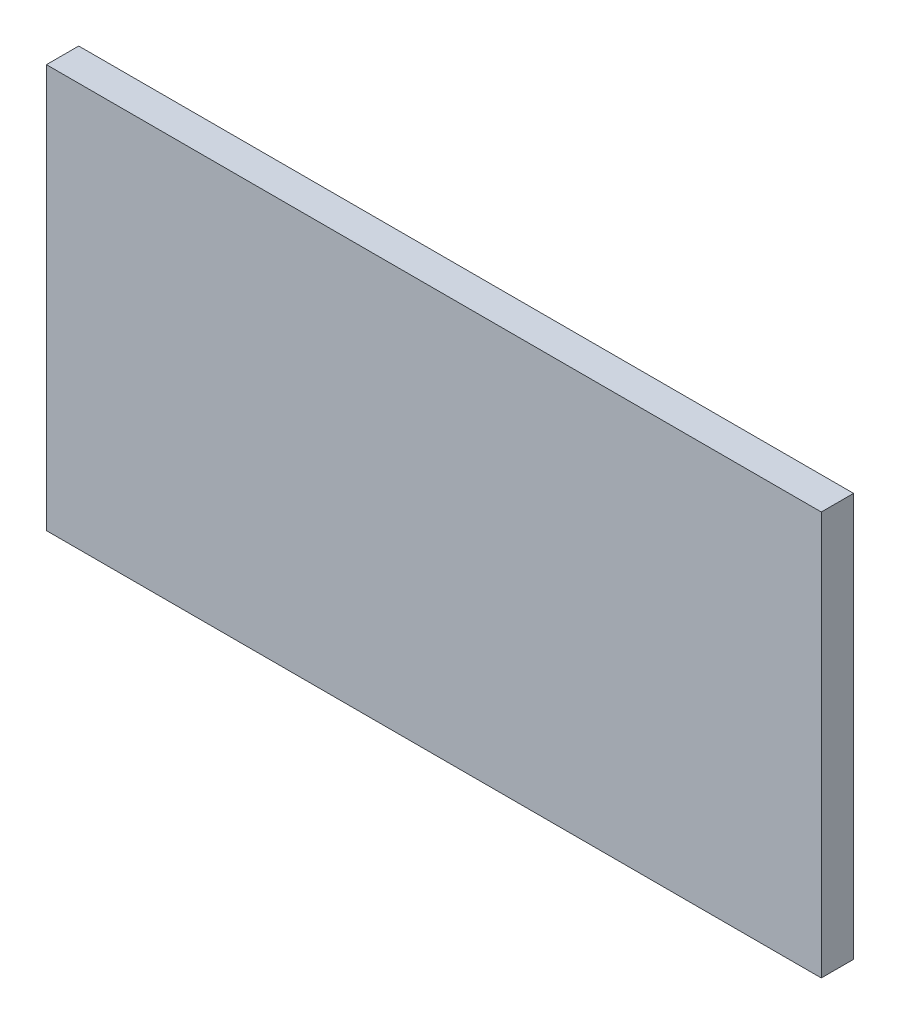
ISO-10303-21;
HEADER;
FILE_DESCRIPTION(('STEP AP214'),'2;1');
FILE_NAME('part.step','',(''),(''),'','','');
FILE_SCHEMA(('AUTOMOTIVE_DESIGN { 1 0 10303 214 1 1 1 1 }'));
ENDSEC;
DATA;
#1=APPLICATION_CONTEXT('core data for automotive mechanical design processes');
#2=APPLICATION_PROTOCOL_DEFINITION('international standard','automotive_design',2000,#1);
#3=PRODUCT_CONTEXT('',#1,'mechanical');
#4=PRODUCT('Part','Part','',(#3));
#5=PRODUCT_RELATED_PRODUCT_CATEGORY('part','',(#4));
#6=PRODUCT_DEFINITION_FORMATION('','',#4);
#7=PRODUCT_DEFINITION_CONTEXT('part definition',#1,'design');
#8=PRODUCT_DEFINITION('design','',#6,#7);
#9=PRODUCT_DEFINITION_SHAPE('','',#8);
#10=(LENGTH_UNIT() NAMED_UNIT(*) SI_UNIT(.MILLI.,.METRE.));
#11=(NAMED_UNIT(*) PLANE_ANGLE_UNIT() SI_UNIT($,.RADIAN.));
#12=(NAMED_UNIT(*) SI_UNIT($,.STERADIAN.) SOLID_ANGLE_UNIT());
#13=UNCERTAINTY_MEASURE_WITH_UNIT(LENGTH_MEASURE(1.E-05),#10,'distance_accuracy_value','');
#14=(GEOMETRIC_REPRESENTATION_CONTEXT(3) GLOBAL_UNCERTAINTY_ASSIGNED_CONTEXT((#13)) GLOBAL_UNIT_ASSIGNED_CONTEXT((#10,
#11,#12)) REPRESENTATION_CONTEXT('',''));
#15=CARTESIAN_POINT('',(0.,0.,0.));
#16=DIRECTION('',(0.,0.,1.));
#17=DIRECTION('',(1.,0.,0.));
#18=AXIS2_PLACEMENT_3D('',#15,#16,#17);
#19=CARTESIAN_POINT('',(187.894314585938,362.678539437355,-50.8));
#20=DIRECTION('',(-1.,0.,0.));
#21=DIRECTION('',(0.,0.,1.));
#22=AXIS2_PLACEMENT_3D('',#19,#20,#21);
#23=PLANE('',#22);
#24=DIRECTION('',(0.,-1.,0.));
#25=VECTOR('',#24,1.);
#26=CARTESIAN_POINT('',(187.894314585938,362.678539437355,0.));
#27=LINE('',#26,#25);
#28=CARTESIAN_POINT('',(187.894314585938,997.678539437355,0.));
#29=VERTEX_POINT('',#28);
#30=CARTESIAN_POINT('',(187.894314585938,362.678539437355,0.));
#31=VERTEX_POINT('',#30);
#32=EDGE_CURVE('E102',#29,#31,#27,.T.);
#33=ORIENTED_EDGE('',*,*,#32,.F.);
#34=DIRECTION('',(0.,0.,1.));
#35=VECTOR('',#34,1.);
#36=CARTESIAN_POINT('',(187.894314585938,997.678539437355,-50.8));
#37=LINE('',#36,#35);
#38=CARTESIAN_POINT('',(187.894314585938,997.678539437355,-50.8));
#39=VERTEX_POINT('',#38);
#40=EDGE_CURVE('E11',#39,#29,#37,.T.);
#41=ORIENTED_EDGE('',*,*,#40,.F.);
#42=DIRECTION('',(0.,-1.,0.));
#43=VECTOR('',#42,1.);
#44=CARTESIAN_POINT('',(187.894314585938,362.678539437355,-50.8));
#45=LINE('',#44,#43);
#46=CARTESIAN_POINT('',(187.894314585938,362.678539437355,-50.8));
#47=VERTEX_POINT('',#46);
#48=EDGE_CURVE('E96',#39,#47,#45,.T.);
#49=ORIENTED_EDGE('',*,*,#48,.T.);
#50=DIRECTION('',(0.,0.,1.));
#51=VECTOR('',#50,1.);
#52=CARTESIAN_POINT('',(187.894314585938,362.678539437355,-50.8));
#53=LINE('',#52,#51);
#54=EDGE_CURVE('E41',#47,#31,#53,.T.);
#55=ORIENTED_EDGE('',*,*,#54,.T.);
#56=EDGE_LOOP('',(#33,#41,#49,#55));
#57=FACE_BOUND('',#56,.T.);
#58=ADVANCED_FACE('F38',(#57),#23,.T.);
#59=CARTESIAN_POINT('',(187.894314585938,997.678539437355,-50.8));
#60=DIRECTION('',(0.,1.,0.));
#61=DIRECTION('',(0.,0.,1.));
#62=AXIS2_PLACEMENT_3D('',#59,#60,#61);
#63=PLANE('',#62);
#64=DIRECTION('',(-1.,0.,0.));
#65=VECTOR('',#64,1.);
#66=CARTESIAN_POINT('',(187.894314585938,997.678539437355,0.));
#67=LINE('',#66,#65);
#68=CARTESIAN_POINT('',(1407.09431458594,997.678539437355,0.));
#69=VERTEX_POINT('',#68);
#70=EDGE_CURVE('E98',#69,#29,#67,.T.);
#71=ORIENTED_EDGE('',*,*,#70,.F.);
#72=DIRECTION('',(0.,0.,1.));
#73=VECTOR('',#72,1.);
#74=CARTESIAN_POINT('',(1407.09431458594,997.678539437355,-50.8));
#75=LINE('',#74,#73);
#76=CARTESIAN_POINT('',(1407.09431458594,997.678539437355,-50.8));
#77=VERTEX_POINT('',#76);
#78=EDGE_CURVE('E47',#77,#69,#75,.T.);
#79=ORIENTED_EDGE('',*,*,#78,.F.);
#80=DIRECTION('',(-1.,0.,0.));
#81=VECTOR('',#80,1.);
#82=CARTESIAN_POINT('',(187.894314585938,997.678539437355,-50.8));
#83=LINE('',#82,#81);
#84=EDGE_CURVE('E93',#77,#39,#83,.T.);
#85=ORIENTED_EDGE('',*,*,#84,.T.);
#86=ORIENTED_EDGE('',*,*,#40,.T.);
#87=EDGE_LOOP('',(#71,#79,#85,#86));
#88=FACE_BOUND('',#87,.T.);
#89=ADVANCED_FACE('F112',(#88),#63,.T.);
#90=CARTESIAN_POINT('',(1407.09431458594,362.678539437355,-50.8));
#91=DIRECTION('',(1.,0.,0.));
#92=DIRECTION('',(0.,0.,-1.));
#93=AXIS2_PLACEMENT_3D('',#90,#91,#92);
#94=PLANE('',#93);
#95=DIRECTION('',(0.,1.,0.));
#96=VECTOR('',#95,1.);
#97=CARTESIAN_POINT('',(1407.09431458594,362.678539437355,0.));
#98=LINE('',#97,#96);
#99=CARTESIAN_POINT('',(1407.09431458594,362.678539437355,0.));
#100=VERTEX_POINT('',#99);
#101=EDGE_CURVE('E88',#100,#69,#98,.T.);
#102=ORIENTED_EDGE('',*,*,#101,.F.);
#103=DIRECTION('',(0.,0.,1.));
#104=VECTOR('',#103,1.);
#105=CARTESIAN_POINT('',(1407.09431458594,362.678539437355,-50.8));
#106=LINE('',#105,#104);
#107=CARTESIAN_POINT('',(1407.09431458594,362.678539437355,-50.8));
#108=VERTEX_POINT('',#107);
#109=EDGE_CURVE('E83',#108,#100,#106,.T.);
#110=ORIENTED_EDGE('',*,*,#109,.F.);
#111=DIRECTION('',(0.,1.,0.));
#112=VECTOR('',#111,1.);
#113=CARTESIAN_POINT('',(1407.09431458594,362.678539437355,-50.8));
#114=LINE('',#113,#112);
#115=EDGE_CURVE('E86',#108,#77,#114,.T.);
#116=ORIENTED_EDGE('',*,*,#115,.T.);
#117=ORIENTED_EDGE('',*,*,#78,.T.);
#118=EDGE_LOOP('',(#102,#110,#116,#117));
#119=FACE_BOUND('',#118,.T.);
#120=ADVANCED_FACE('F85',(#119),#94,.T.);
#121=CARTESIAN_POINT('',(187.894314585938,362.678539437355,-50.8));
#122=DIRECTION('',(0.,-1.,0.));
#123=DIRECTION('',(0.,0.,-1.));
#124=AXIS2_PLACEMENT_3D('',#121,#122,#123);
#125=PLANE('',#124);
#126=DIRECTION('',(1.,0.,0.));
#127=VECTOR('',#126,1.);
#128=CARTESIAN_POINT('',(187.894314585938,362.678539437355,0.));
#129=LINE('',#128,#127);
#130=EDGE_CURVE('E105',#31,#100,#129,.T.);
#131=ORIENTED_EDGE('',*,*,#130,.F.);
#132=ORIENTED_EDGE('',*,*,#54,.F.);
#133=DIRECTION('',(1.,0.,0.));
#134=VECTOR('',#133,1.);
#135=CARTESIAN_POINT('',(187.894314585938,362.678539437355,-50.8));
#136=LINE('',#135,#134);
#137=EDGE_CURVE('E92',#47,#108,#136,.T.);
#138=ORIENTED_EDGE('',*,*,#137,.T.);
#139=ORIENTED_EDGE('',*,*,#109,.T.);
#140=EDGE_LOOP('',(#131,#132,#138,#139));
#141=FACE_BOUND('',#140,.T.);
#142=ADVANCED_FACE('F95',(#141),#125,.T.);
#143=CARTESIAN_POINT('',(0.,0.,-50.8));
#144=DIRECTION('',(0.,0.,-1.));
#145=DIRECTION('',(-1.,0.,0.));
#146=AXIS2_PLACEMENT_3D('',#143,#144,#145);
#147=PLANE('',#146);
#148=ORIENTED_EDGE('',*,*,#48,.F.);
#149=ORIENTED_EDGE('',*,*,#84,.F.);
#150=ORIENTED_EDGE('',*,*,#115,.F.);
#151=ORIENTED_EDGE('',*,*,#137,.F.);
#152=EDGE_LOOP('',(#148,#149,#150,#151));
#153=FACE_BOUND('',#152,.T.);
#154=ADVANCED_FACE('F91',(#153),#147,.T.);
#155=CARTESIAN_POINT('',(0.,0.,0.));
#156=DIRECTION('',(0.,0.,-1.));
#157=DIRECTION('',(-1.,0.,0.));
#158=AXIS2_PLACEMENT_3D('',#155,#156,#157);
#159=PLANE('',#158);
#160=ORIENTED_EDGE('',*,*,#32,.T.);
#161=ORIENTED_EDGE('',*,*,#130,.T.);
#162=ORIENTED_EDGE('',*,*,#101,.T.);
#163=ORIENTED_EDGE('',*,*,#70,.T.);
#164=EDGE_LOOP('',(#160,#161,#162,#163));
#165=FACE_BOUND('',#164,.T.);
#166=ADVANCED_FACE('F111',(#165),#159,.F.);
#167=CLOSED_SHELL('',(#58,#89,#120,#142,#154,#166));
#168=MANIFOLD_SOLID_BREP('B2',#167);
#169=ADVANCED_BREP_SHAPE_REPRESENTATION('',(#18,#168),#14);
#170=SHAPE_DEFINITION_REPRESENTATION(#9,#169);
ENDSEC;
END-ISO-10303-21;
